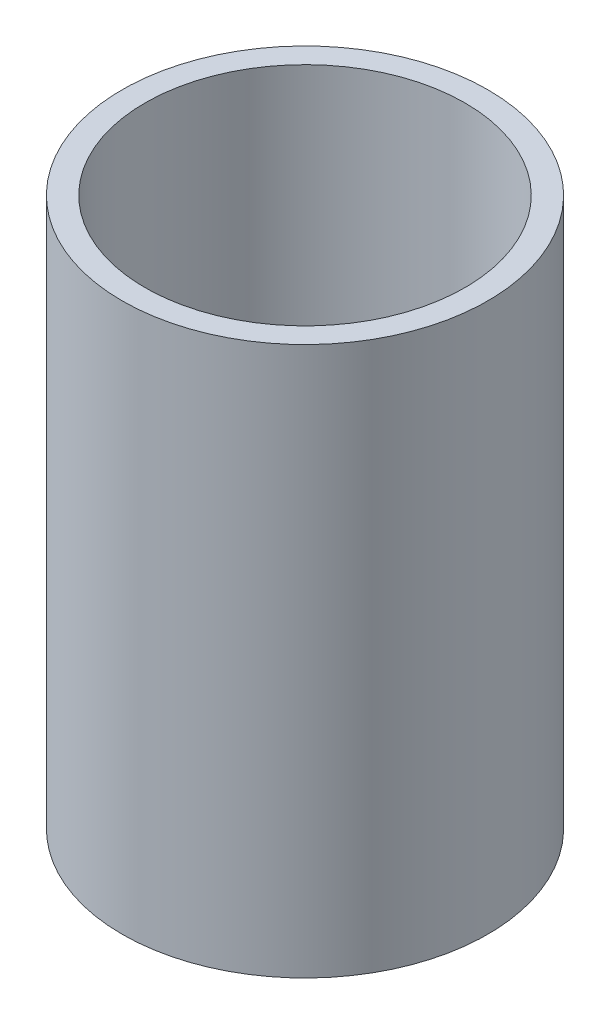
ISO-10303-21;
HEADER;
FILE_DESCRIPTION(('STEP AP214'),'2;1');
FILE_NAME('part.step','',(''),(''),'','','');
FILE_SCHEMA(('AUTOMOTIVE_DESIGN { 1 0 10303 214 1 1 1 1 }'));
ENDSEC;
DATA;
#1=APPLICATION_CONTEXT('core data for automotive mechanical design processes');
#2=APPLICATION_PROTOCOL_DEFINITION('international standard','automotive_design',2000,#1);
#3=PRODUCT_CONTEXT('',#1,'mechanical');
#4=PRODUCT('Part','Part','',(#3));
#5=PRODUCT_RELATED_PRODUCT_CATEGORY('part','',(#4));
#6=PRODUCT_DEFINITION_FORMATION('','',#4);
#7=PRODUCT_DEFINITION_CONTEXT('part definition',#1,'design');
#8=PRODUCT_DEFINITION('design','',#6,#7);
#9=PRODUCT_DEFINITION_SHAPE('','',#8);
#10=(LENGTH_UNIT() NAMED_UNIT(*) SI_UNIT(.MILLI.,.METRE.));
#11=(NAMED_UNIT(*) PLANE_ANGLE_UNIT() SI_UNIT($,.RADIAN.));
#12=(NAMED_UNIT(*) SI_UNIT($,.STERADIAN.) SOLID_ANGLE_UNIT());
#13=UNCERTAINTY_MEASURE_WITH_UNIT(LENGTH_MEASURE(1.E-05),#10,'distance_accuracy_value','');
#14=(GEOMETRIC_REPRESENTATION_CONTEXT(3) GLOBAL_UNCERTAINTY_ASSIGNED_CONTEXT((#13)) GLOBAL_UNIT_ASSIGNED_CONTEXT((#10,
#11,#12)) REPRESENTATION_CONTEXT('',''));
#15=CARTESIAN_POINT('',(0.,0.,0.));
#16=DIRECTION('',(0.,0.,1.));
#17=DIRECTION('',(1.,0.,0.));
#18=AXIS2_PLACEMENT_3D('',#15,#16,#17);
#19=CARTESIAN_POINT('',(0.,38.1,0.));
#20=DIRECTION('',(0.,1.,0.));
#21=DIRECTION('',(0.,0.,1.));
#22=AXIS2_PLACEMENT_3D('',#19,#20,#21);
#23=PLANE('',#22);
#24=CARTESIAN_POINT('',(0.,38.1,0.));
#25=DIRECTION('',(0.,1.,0.));
#26=DIRECTION('',(0.,0.,1.));
#27=AXIS2_PLACEMENT_3D('',#24,#25,#26);
#28=CIRCLE('',#27,12.7);
#29=CARTESIAN_POINT('',(0.,38.1,-12.7));
#30=VERTEX_POINT('',#29);
#31=EDGE_CURVE('E10',#30,#30,#28,.T.);
#32=ORIENTED_EDGE('',*,*,#31,.T.);
#33=EDGE_LOOP('',(#32));
#34=FACE_BOUND('',#33,.T.);
#35=CARTESIAN_POINT('',(0.,38.1,0.));
#36=DIRECTION('',(0.,1.,0.));
#37=DIRECTION('',(0.,0.,1.));
#38=AXIS2_PLACEMENT_3D('',#35,#36,#37);
#39=CIRCLE('',#38,11.1125);
#40=CARTESIAN_POINT('',(0.,38.1,-11.1125));
#41=VERTEX_POINT('',#40);
#42=EDGE_CURVE('E43',#41,#41,#39,.T.);
#43=ORIENTED_EDGE('',*,*,#42,.F.);
#44=EDGE_LOOP('',(#43));
#45=FACE_BOUND('',#44,.T.);
#46=ADVANCED_FACE('F32',(#34,#45),#23,.T.);
#47=CARTESIAN_POINT('',(0.,0.,0.));
#48=DIRECTION('',(0.,1.,0.));
#49=DIRECTION('',(0.,0.,1.));
#50=AXIS2_PLACEMENT_3D('',#47,#48,#49);
#51=PLANE('',#50);
#52=CARTESIAN_POINT('',(0.,0.,0.));
#53=DIRECTION('',(0.,1.,0.));
#54=DIRECTION('',(0.,0.,1.));
#55=AXIS2_PLACEMENT_3D('',#52,#53,#54);
#56=CIRCLE('',#55,12.7);
#57=CARTESIAN_POINT('',(0.,0.,-12.7));
#58=VERTEX_POINT('',#57);
#59=EDGE_CURVE('E36',#58,#58,#56,.T.);
#60=ORIENTED_EDGE('',*,*,#59,.F.);
#61=EDGE_LOOP('',(#60));
#62=FACE_BOUND('',#61,.T.);
#63=CARTESIAN_POINT('',(0.,0.,0.));
#64=DIRECTION('',(0.,1.,0.));
#65=DIRECTION('',(0.,0.,1.));
#66=AXIS2_PLACEMENT_3D('',#63,#64,#65);
#67=CIRCLE('',#66,11.1125);
#68=CARTESIAN_POINT('',(0.,0.,-11.1125));
#69=VERTEX_POINT('',#68);
#70=EDGE_CURVE('E45',#69,#69,#67,.T.);
#71=ORIENTED_EDGE('',*,*,#70,.T.);
#72=EDGE_LOOP('',(#71));
#73=FACE_BOUND('',#72,.T.);
#74=ADVANCED_FACE('F55',(#62,#73),#51,.F.);
#75=CARTESIAN_POINT('',(0.,38.1,0.));
#76=DIRECTION('',(0.,-1.,0.));
#77=DIRECTION('',(0.,0.,-1.));
#78=AXIS2_PLACEMENT_3D('',#75,#76,#77);
#79=CYLINDRICAL_SURFACE('',#78,12.7);
#80=CARTESIAN_POINT('',(0.,38.1,-12.7));
#81=CARTESIAN_POINT('',(0.,37.703125,-12.7));
#82=CARTESIAN_POINT('',(0.,37.30625,-12.7));
#83=CARTESIAN_POINT('',(0.,36.5125,-12.7));
#84=CARTESIAN_POINT('',(0.,36.115625,-12.7));
#85=CARTESIAN_POINT('',(0.,35.321875,-12.7));
#86=CARTESIAN_POINT('',(0.,34.925,-12.7));
#87=CARTESIAN_POINT('',(0.,34.13125,-12.7));
#88=CARTESIAN_POINT('',(0.,33.734375,-12.7));
#89=CARTESIAN_POINT('',(0.,32.940625,-12.7));
#90=CARTESIAN_POINT('',(0.,32.54375,-12.7));
#91=CARTESIAN_POINT('',(0.,31.75,-12.7));
#92=CARTESIAN_POINT('',(0.,31.353125,-12.7));
#93=CARTESIAN_POINT('',(0.,30.559375,-12.7));
#94=CARTESIAN_POINT('',(0.,30.1625,-12.7));
#95=CARTESIAN_POINT('',(0.,29.36875,-12.7));
#96=CARTESIAN_POINT('',(0.,28.971875,-12.7));
#97=CARTESIAN_POINT('',(0.,28.178125,-12.7));
#98=CARTESIAN_POINT('',(0.,27.78125,-12.7));
#99=CARTESIAN_POINT('',(0.,26.9875,-12.7));
#100=CARTESIAN_POINT('',(0.,26.590625,-12.7));
#101=CARTESIAN_POINT('',(0.,25.796875,-12.7));
#102=CARTESIAN_POINT('',(0.,25.4,-12.7));
#103=CARTESIAN_POINT('',(0.,24.60625,-12.7));
#104=CARTESIAN_POINT('',(0.,24.209375,-12.7));
#105=CARTESIAN_POINT('',(0.,23.415625,-12.7));
#106=CARTESIAN_POINT('',(0.,23.01875,-12.7));
#107=CARTESIAN_POINT('',(0.,22.225,-12.7));
#108=CARTESIAN_POINT('',(0.,21.828125,-12.7));
#109=CARTESIAN_POINT('',(0.,21.034375,-12.7));
#110=CARTESIAN_POINT('',(0.,20.6375,-12.7));
#111=CARTESIAN_POINT('',(0.,19.84375,-12.7));
#112=CARTESIAN_POINT('',(0.,19.446875,-12.7));
#113=CARTESIAN_POINT('',(0.,18.653125,-12.7));
#114=CARTESIAN_POINT('',(0.,18.25625,-12.7));
#115=CARTESIAN_POINT('',(0.,17.4625,-12.7));
#116=CARTESIAN_POINT('',(0.,17.065625,-12.7));
#117=CARTESIAN_POINT('',(0.,16.271875,-12.7));
#118=CARTESIAN_POINT('',(0.,15.875,-12.7));
#119=CARTESIAN_POINT('',(0.,15.08125,-12.7));
#120=CARTESIAN_POINT('',(0.,14.684375,-12.7));
#121=CARTESIAN_POINT('',(0.,13.890625,-12.7));
#122=CARTESIAN_POINT('',(0.,13.49375,-12.7));
#123=CARTESIAN_POINT('',(0.,12.7,-12.7));
#124=CARTESIAN_POINT('',(0.,12.303125,-12.7));
#125=CARTESIAN_POINT('',(0.,11.509375,-12.7));
#126=CARTESIAN_POINT('',(0.,11.1125,-12.7));
#127=CARTESIAN_POINT('',(0.,10.31875,-12.7));
#128=CARTESIAN_POINT('',(0.,9.92187499999999,-12.7));
#129=CARTESIAN_POINT('',(0.,9.128125,-12.7));
#130=CARTESIAN_POINT('',(0.,8.73124999999999,-12.7));
#131=CARTESIAN_POINT('',(0.,7.93749999999999,-12.7));
#132=CARTESIAN_POINT('',(0.,7.54062499999999,-12.7));
#133=CARTESIAN_POINT('',(0.,6.746875,-12.7));
#134=CARTESIAN_POINT('',(0.,6.35,-12.7));
#135=CARTESIAN_POINT('',(0.,5.55625,-12.7));
#136=CARTESIAN_POINT('',(0.,5.159375,-12.7));
#137=CARTESIAN_POINT('',(0.,4.365625,-12.7));
#138=CARTESIAN_POINT('',(0.,3.96875,-12.7));
#139=CARTESIAN_POINT('',(0.,3.175,-12.7));
#140=CARTESIAN_POINT('',(0.,2.778125,-12.7));
#141=CARTESIAN_POINT('',(0.,1.984375,-12.7));
#142=CARTESIAN_POINT('',(0.,1.5875,-12.7));
#143=CARTESIAN_POINT('',(0.,0.79375,-12.7));
#144=CARTESIAN_POINT('',(0.,0.396875,-12.7));
#145=CARTESIAN_POINT('',(0.,0.,-12.7));
#146=B_SPLINE_CURVE_WITH_KNOTS('',3,(#80,#81,#82,#83,#84,#85,#86,#87,#88,#89,#90,#91,#92,#93,
#94,#95,#96,#97,#98,#99,#100,#101,#102,#103,#104,#105,#106,#107,#108,#109,#110,#111,#112,#113,
#114,#115,#116,#117,#118,#119,#120,#121,#122,#123,#124,#125,#126,#127,#128,#129,#130,#131,#132,
#133,#134,#135,#136,#137,#138,#139,#140,#141,#142,#143,#144,#145),.UNSPECIFIED.,.F.,.F.,(4,2,2,
2,2,2,2,2,2,2,2,2,2,2,2,2,2,2,2,2,2,2,2,2,2,2,2,2,2,2,2,2,4),(0.,1.190625,2.38125,3.571875,
4.7625,5.953125,7.14375,8.334375,9.52500000000001,10.715625,11.90625,13.096875,14.2875,
15.478125,16.66875,17.859375,19.05,20.240625,21.43125,22.621875,23.8125,25.003125,26.19375,
27.384375,28.575,29.765625,30.95625,32.146875,33.3375,34.528125,35.71875,36.909375,38.1),.UNSPECIFIED.);
#147=EDGE_CURVE('BSEAM34',#30,#58,#146,.T.);
#148=ORIENTED_EDGE('',*,*,#31,.F.);
#149=ORIENTED_EDGE('',*,*,#59,.T.);
#150=ORIENTED_EDGE('',*,*,#147,.T.);
#151=ORIENTED_EDGE('',*,*,#147,.F.);
#152=EDGE_LOOP('',(#148,#150,#149,#151));
#153=FACE_BOUND('',#152,.T.);
#154=ADVANCED_FACE('F34',(#153),#79,.T.);
#155=CARTESIAN_POINT('',(0.,38.1,0.));
#156=DIRECTION('',(0.,-1.,0.));
#157=DIRECTION('',(0.,0.,-1.));
#158=AXIS2_PLACEMENT_3D('',#155,#156,#157);
#159=CYLINDRICAL_SURFACE('',#158,11.1125);
#160=CARTESIAN_POINT('',(0.,38.1,-11.1125));
#161=CARTESIAN_POINT('',(0.,37.703125,-11.1125));
#162=CARTESIAN_POINT('',(0.,37.30625,-11.1125));
#163=CARTESIAN_POINT('',(0.,36.5125,-11.1125));
#164=CARTESIAN_POINT('',(0.,36.115625,-11.1125));
#165=CARTESIAN_POINT('',(0.,35.321875,-11.1125));
#166=CARTESIAN_POINT('',(0.,34.925,-11.1125));
#167=CARTESIAN_POINT('',(0.,34.13125,-11.1125));
#168=CARTESIAN_POINT('',(0.,33.734375,-11.1125));
#169=CARTESIAN_POINT('',(0.,32.940625,-11.1125));
#170=CARTESIAN_POINT('',(0.,32.54375,-11.1125));
#171=CARTESIAN_POINT('',(0.,31.75,-11.1125));
#172=CARTESIAN_POINT('',(0.,31.353125,-11.1125));
#173=CARTESIAN_POINT('',(0.,30.559375,-11.1125));
#174=CARTESIAN_POINT('',(0.,30.1625,-11.1125));
#175=CARTESIAN_POINT('',(0.,29.36875,-11.1125));
#176=CARTESIAN_POINT('',(0.,28.971875,-11.1125));
#177=CARTESIAN_POINT('',(0.,28.178125,-11.1125));
#178=CARTESIAN_POINT('',(0.,27.78125,-11.1125));
#179=CARTESIAN_POINT('',(0.,26.9875,-11.1125));
#180=CARTESIAN_POINT('',(0.,26.590625,-11.1125));
#181=CARTESIAN_POINT('',(0.,25.796875,-11.1125));
#182=CARTESIAN_POINT('',(0.,25.4,-11.1125));
#183=CARTESIAN_POINT('',(0.,24.60625,-11.1125));
#184=CARTESIAN_POINT('',(0.,24.209375,-11.1125));
#185=CARTESIAN_POINT('',(0.,23.415625,-11.1125));
#186=CARTESIAN_POINT('',(0.,23.01875,-11.1125));
#187=CARTESIAN_POINT('',(0.,22.225,-11.1125));
#188=CARTESIAN_POINT('',(0.,21.828125,-11.1125));
#189=CARTESIAN_POINT('',(0.,21.034375,-11.1125));
#190=CARTESIAN_POINT('',(0.,20.6375,-11.1125));
#191=CARTESIAN_POINT('',(0.,19.84375,-11.1125));
#192=CARTESIAN_POINT('',(0.,19.446875,-11.1125));
#193=CARTESIAN_POINT('',(0.,18.653125,-11.1125));
#194=CARTESIAN_POINT('',(0.,18.25625,-11.1125));
#195=CARTESIAN_POINT('',(0.,17.4625,-11.1125));
#196=CARTESIAN_POINT('',(0.,17.065625,-11.1125));
#197=CARTESIAN_POINT('',(0.,16.271875,-11.1125));
#198=CARTESIAN_POINT('',(0.,15.875,-11.1125));
#199=CARTESIAN_POINT('',(0.,15.08125,-11.1125));
#200=CARTESIAN_POINT('',(0.,14.684375,-11.1125));
#201=CARTESIAN_POINT('',(0.,13.890625,-11.1125));
#202=CARTESIAN_POINT('',(0.,13.49375,-11.1125));
#203=CARTESIAN_POINT('',(0.,12.7,-11.1125));
#204=CARTESIAN_POINT('',(0.,12.303125,-11.1125));
#205=CARTESIAN_POINT('',(0.,11.509375,-11.1125));
#206=CARTESIAN_POINT('',(0.,11.1125,-11.1125));
#207=CARTESIAN_POINT('',(0.,10.31875,-11.1125));
#208=CARTESIAN_POINT('',(0.,9.921875,-11.1125));
#209=CARTESIAN_POINT('',(0.,9.128125,-11.1125));
#210=CARTESIAN_POINT('',(0.,8.73125,-11.1125));
#211=CARTESIAN_POINT('',(0.,7.9375,-11.1125));
#212=CARTESIAN_POINT('',(0.,7.540625,-11.1125));
#213=CARTESIAN_POINT('',(0.,6.746875,-11.1125));
#214=CARTESIAN_POINT('',(0.,6.35,-11.1125));
#215=CARTESIAN_POINT('',(0.,5.55625,-11.1125));
#216=CARTESIAN_POINT('',(0.,5.159375,-11.1125));
#217=CARTESIAN_POINT('',(0.,4.365625,-11.1125));
#218=CARTESIAN_POINT('',(0.,3.96875,-11.1125));
#219=CARTESIAN_POINT('',(0.,3.175,-11.1125));
#220=CARTESIAN_POINT('',(0.,2.778125,-11.1125));
#221=CARTESIAN_POINT('',(0.,1.984375,-11.1125));
#222=CARTESIAN_POINT('',(0.,1.5875,-11.1125));
#223=CARTESIAN_POINT('',(0.,0.79375,-11.1125));
#224=CARTESIAN_POINT('',(0.,0.396875,-11.1125));
#225=CARTESIAN_POINT('',(0.,0.,-11.1125));
#226=B_SPLINE_CURVE_WITH_KNOTS('',3,(#160,#161,#162,#163,#164,#165,#166,#167,#168,#169,#170,
#171,#172,#173,#174,#175,#176,#177,#178,#179,#180,#181,#182,#183,#184,#185,#186,#187,#188,#189,
#190,#191,#192,#193,#194,#195,#196,#197,#198,#199,#200,#201,#202,#203,#204,#205,#206,#207,#208,
#209,#210,#211,#212,#213,#214,#215,#216,#217,#218,#219,#220,#221,#222,#223,#224,#225),
.UNSPECIFIED.,.F.,.F.,(4,2,2,2,2,2,2,2,2,2,2,2,2,2,2,2,2,2,2,2,2,2,2,2,2,2,2,2,2,2,2,2,4),(0.,
1.19062499999999,2.38124999999999,3.571875,4.7625,5.953125,7.14375,8.33437499999999,9.525,
10.715625,11.90625,13.096875,14.2875,15.478125,16.66875,17.859375,19.05,20.240625,21.43125,
22.621875,23.8125,25.003125,26.19375,27.384375,28.575,29.765625,30.95625,32.146875,33.3375,
34.528125,35.71875,36.909375,38.1),.UNSPECIFIED.);
#227=EDGE_CURVE('BSEAM51',#41,#69,#226,.T.);
#228=ORIENTED_EDGE('',*,*,#42,.T.);
#229=ORIENTED_EDGE('',*,*,#70,.F.);
#230=ORIENTED_EDGE('',*,*,#227,.T.);
#231=ORIENTED_EDGE('',*,*,#227,.F.);
#232=EDGE_LOOP('',(#228,#230,#229,#231));
#233=FACE_BOUND('',#232,.T.);
#234=ADVANCED_FACE('F51',(#233),#159,.F.);
#235=CLOSED_SHELL('',(#46,#74,#154,#234));
#236=MANIFOLD_SOLID_BREP('B2',#235);
#237=ADVANCED_BREP_SHAPE_REPRESENTATION('',(#18,#236),#14);
#238=SHAPE_DEFINITION_REPRESENTATION(#9,#237);
ENDSEC;
END-ISO-10303-21;
